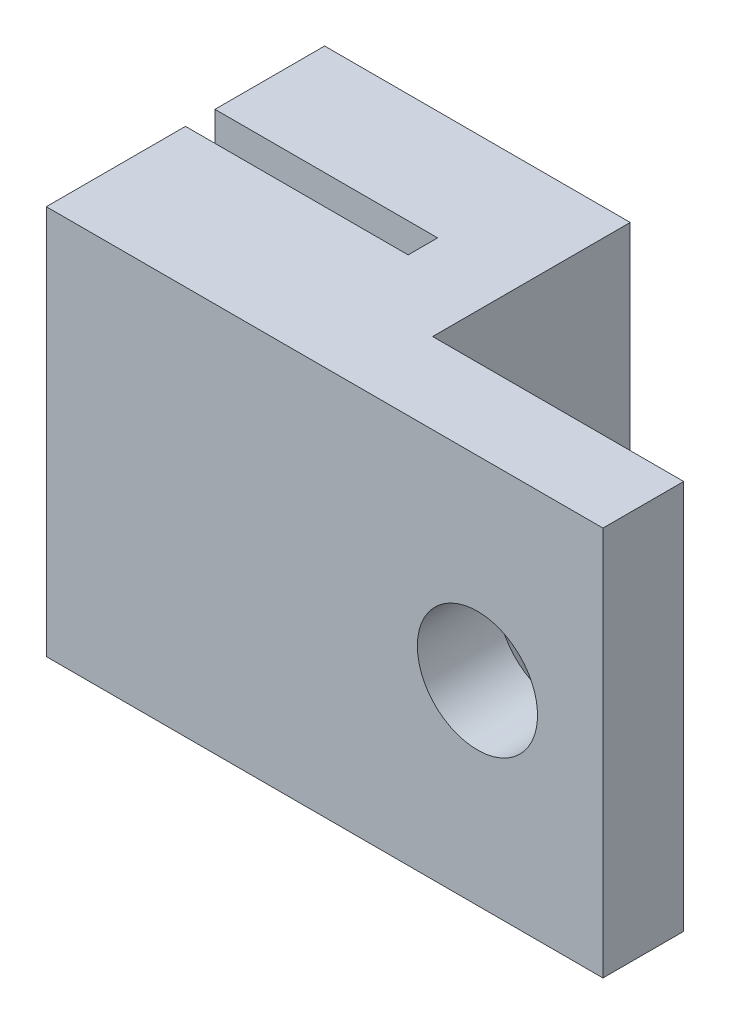
ISO-10303-21;
HEADER;
FILE_DESCRIPTION(('STEP AP214'),'2;1');
FILE_NAME('part.step','',(''),(''),'','','');
FILE_SCHEMA(('AUTOMOTIVE_DESIGN { 1 0 10303 214 1 1 1 1 }'));
ENDSEC;
DATA;
#1=APPLICATION_CONTEXT('core data for automotive mechanical design processes');
#2=APPLICATION_PROTOCOL_DEFINITION('international standard','automotive_design',2000,#1);
#3=PRODUCT_CONTEXT('',#1,'mechanical');
#4=PRODUCT('Part','Part','',(#3));
#5=PRODUCT_RELATED_PRODUCT_CATEGORY('part','',(#4));
#6=PRODUCT_DEFINITION_FORMATION('','',#4);
#7=PRODUCT_DEFINITION_CONTEXT('part definition',#1,'design');
#8=PRODUCT_DEFINITION('design','',#6,#7);
#9=PRODUCT_DEFINITION_SHAPE('','',#8);
#10=(LENGTH_UNIT() NAMED_UNIT(*) SI_UNIT(.MILLI.,.METRE.));
#11=(NAMED_UNIT(*) PLANE_ANGLE_UNIT() SI_UNIT($,.RADIAN.));
#12=(NAMED_UNIT(*) SI_UNIT($,.STERADIAN.) SOLID_ANGLE_UNIT());
#13=UNCERTAINTY_MEASURE_WITH_UNIT(LENGTH_MEASURE(1.E-05),#10,'distance_accuracy_value','');
#14=(GEOMETRIC_REPRESENTATION_CONTEXT(3) GLOBAL_UNCERTAINTY_ASSIGNED_CONTEXT((#13)) GLOBAL_UNIT_ASSIGNED_CONTEXT((#10,
#11,#12)) REPRESENTATION_CONTEXT('',''));
#15=CARTESIAN_POINT('',(0.,0.,0.));
#16=DIRECTION('',(0.,0.,1.));
#17=DIRECTION('',(1.,0.,0.));
#18=AXIS2_PLACEMENT_3D('',#15,#16,#17);
#19=CARTESIAN_POINT('',(0.,-14.,391.676417727354));
#20=DIRECTION('',(0.,0.,1.));
#21=DIRECTION('',(1.,0.,0.));
#22=AXIS2_PLACEMENT_3D('',#19,#20,#21);
#23=PLANE('',#22);
#24=DIRECTION('',(1.,0.,0.));
#25=VECTOR('',#24,1.);
#26=CARTESIAN_POINT('',(0.,0.,391.676417727354));
#27=LINE('',#26,#25);
#28=CARTESIAN_POINT('',(-1237.71012145749,0.,391.676417727354));
#29=VERTEX_POINT('',#28);
#30=CARTESIAN_POINT('',(-1229.71012145749,0.,391.676417727354));
#31=VERTEX_POINT('',#30);
#32=EDGE_CURVE('E144',#29,#31,#27,.T.);
#33=ORIENTED_EDGE('',*,*,#32,.F.);
#34=DIRECTION('',(0.,1.,0.));
#35=VECTOR('',#34,1.);
#36=CARTESIAN_POINT('',(-1237.71012145749,-14.,391.676417727354));
#37=LINE('',#36,#35);
#38=CARTESIAN_POINT('',(-1237.71012145749,-14.,391.676417727354));
#39=VERTEX_POINT('',#38);
#40=EDGE_CURVE('E11',#39,#29,#37,.T.);
#41=ORIENTED_EDGE('',*,*,#40,.F.);
#42=DIRECTION('',(1.,0.,0.));
#43=VECTOR('',#42,1.);
#44=CARTESIAN_POINT('',(0.,-14.,391.676417727354));
#45=LINE('',#44,#43);
#46=CARTESIAN_POINT('',(-1229.71012145749,-14.,391.676417727354));
#47=VERTEX_POINT('',#46);
#48=EDGE_CURVE('E173',#39,#47,#45,.T.);
#49=ORIENTED_EDGE('',*,*,#48,.T.);
#50=DIRECTION('',(0.,1.,0.));
#51=VECTOR('',#50,1.);
#52=CARTESIAN_POINT('',(-1229.71012145749,-14.,391.676417727354));
#53=LINE('',#52,#51);
#54=EDGE_CURVE('E38',#47,#31,#53,.T.);
#55=ORIENTED_EDGE('',*,*,#54,.T.);
#56=EDGE_LOOP('',(#33,#41,#49,#55));
#57=FACE_BOUND('',#56,.T.);
#58=ADVANCED_FACE('F35',(#57),#23,.T.);
#59=CARTESIAN_POINT('',(-1237.71012145749,-14.,0.));
#60=DIRECTION('',(1.,0.,0.));
#61=DIRECTION('',(0.,0.,-1.));
#62=AXIS2_PLACEMENT_3D('',#59,#60,#61);
#63=PLANE('',#62);
#64=DIRECTION('',(0.,0.,-1.));
#65=VECTOR('',#64,1.);
#66=CARTESIAN_POINT('',(-1237.71012145749,0.,0.));
#67=LINE('',#66,#65);
#68=CARTESIAN_POINT('',(-1237.71012145749,0.,387.736417727354));
#69=VERTEX_POINT('',#68);
#70=EDGE_CURVE('E157',#29,#69,#67,.T.);
#71=ORIENTED_EDGE('',*,*,#70,.T.);
#72=DIRECTION('',(0.,1.,0.));
#73=VECTOR('',#72,1.);
#74=CARTESIAN_POINT('',(-1237.71012145749,-14.,387.736417727354));
#75=LINE('',#74,#73);
#76=CARTESIAN_POINT('',(-1237.71012145749,-14.,387.736417727354));
#77=VERTEX_POINT('',#76);
#78=EDGE_CURVE('E43',#77,#69,#75,.T.);
#79=ORIENTED_EDGE('',*,*,#78,.F.);
#80=DIRECTION('',(0.,0.,-1.));
#81=VECTOR('',#80,1.);
#82=CARTESIAN_POINT('',(-1237.71012145749,-14.,0.));
#83=LINE('',#82,#81);
#84=EDGE_CURVE('E140',#39,#77,#83,.T.);
#85=ORIENTED_EDGE('',*,*,#84,.F.);
#86=ORIENTED_EDGE('',*,*,#40,.T.);
#87=EDGE_LOOP('',(#71,#79,#85,#86));
#88=FACE_BOUND('',#87,.T.);
#89=ADVANCED_FACE('F174',(#88),#63,.F.);
#90=CARTESIAN_POINT('',(0.,-14.,387.736417727354));
#91=DIRECTION('',(0.,0.,1.));
#92=DIRECTION('',(1.,0.,0.));
#93=AXIS2_PLACEMENT_3D('',#90,#91,#92);
#94=PLANE('',#93);
#95=DIRECTION('',(1.,0.,0.));
#96=VECTOR('',#95,1.);
#97=CARTESIAN_POINT('',(0.,0.,387.736417727354));
#98=LINE('',#97,#96);
#99=CARTESIAN_POINT('',(-1226.72982017208,0.,387.736417727354));
#100=VERTEX_POINT('',#99);
#101=EDGE_CURVE('E160',#69,#100,#98,.T.);
#102=ORIENTED_EDGE('',*,*,#101,.T.);
#103=DIRECTION('',(0.,1.,0.));
#104=VECTOR('',#103,1.);
#105=CARTESIAN_POINT('',(-1226.72982017208,-14.,387.736417727354));
#106=LINE('',#105,#104);
#107=CARTESIAN_POINT('',(-1226.72982017208,-14.,387.736417727354));
#108=VERTEX_POINT('',#107);
#109=EDGE_CURVE('E148',#108,#100,#106,.T.);
#110=ORIENTED_EDGE('',*,*,#109,.F.);
#111=DIRECTION('',(1.,0.,0.));
#112=VECTOR('',#111,1.);
#113=CARTESIAN_POINT('',(0.,-14.,387.736417727354));
#114=LINE('',#113,#112);
#115=EDGE_CURVE('E132',#77,#108,#114,.T.);
#116=ORIENTED_EDGE('',*,*,#115,.F.);
#117=ORIENTED_EDGE('',*,*,#78,.T.);
#118=EDGE_LOOP('',(#102,#110,#116,#117));
#119=FACE_BOUND('',#118,.T.);
#120=ADVANCED_FACE('F178',(#119),#94,.F.);
#121=CARTESIAN_POINT('',(-1217.71012145749,-14.,0.));
#122=DIRECTION('',(1.,0.,0.));
#123=DIRECTION('',(0.,0.,-1.));
#124=AXIS2_PLACEMENT_3D('',#121,#122,#123);
#125=PLANE('',#124);
#126=DIRECTION('',(0.,1.,0.));
#127=VECTOR('',#126,1.);
#128=CARTESIAN_POINT('',(-1217.71012145749,-14.,394.836001477778));
#129=LINE('',#128,#127);
#130=CARTESIAN_POINT('',(-1217.71012145749,-14.,394.836001477778));
#131=VERTEX_POINT('',#130);
#132=CARTESIAN_POINT('',(-1217.71012145749,0.,394.836001477778));
#133=VERTEX_POINT('',#132);
#134=EDGE_CURVE('E181',#131,#133,#129,.T.);
#135=ORIENTED_EDGE('',*,*,#134,.T.);
#136=DIRECTION('',(0.,0.,-1.));
#137=VECTOR('',#136,1.);
#138=CARTESIAN_POINT('',(-1217.71012145749,0.,0.));
#139=LINE('',#138,#137);
#140=CARTESIAN_POINT('',(-1217.71012145749,0.,397.736417727354));
#141=VERTEX_POINT('',#140);
#142=EDGE_CURVE('E116',#141,#133,#139,.T.);
#143=ORIENTED_EDGE('',*,*,#142,.F.);
#144=DIRECTION('',(0.,1.,0.));
#145=VECTOR('',#144,1.);
#146=CARTESIAN_POINT('',(-1217.71012145749,-14.,397.736417727354));
#147=LINE('',#146,#145);
#148=CARTESIAN_POINT('',(-1217.71012145749,-14.,397.736417727354));
#149=VERTEX_POINT('',#148);
#150=EDGE_CURVE('E109',#149,#141,#147,.T.);
#151=ORIENTED_EDGE('',*,*,#150,.F.);
#152=DIRECTION('',(0.,0.,-1.));
#153=VECTOR('',#152,1.);
#154=CARTESIAN_POINT('',(-1217.71012145749,-14.,0.));
#155=LINE('',#154,#153);
#156=EDGE_CURVE('E114',#149,#131,#155,.T.);
#157=ORIENTED_EDGE('',*,*,#156,.T.);
#158=EDGE_LOOP('',(#135,#143,#151,#157));
#159=FACE_BOUND('',#158,.T.);
#160=ADVANCED_FACE('F112',(#159),#125,.T.);
#161=CARTESIAN_POINT('',(0.,-14.,397.736417727354));
#162=DIRECTION('',(0.,0.,1.));
#163=DIRECTION('',(1.,0.,0.));
#164=AXIS2_PLACEMENT_3D('',#161,#162,#163);
#165=PLANE('',#164);
#166=CARTESIAN_POINT('',(-1222.21997081479,-7.,397.736417727354));
#167=DIRECTION('',(0.,0.,-1.));
#168=DIRECTION('',(-1.,0.,0.));
#169=AXIS2_PLACEMENT_3D('',#166,#167,#168);
#170=CIRCLE('',#169,2.15899999999997);
#171=CARTESIAN_POINT('',(-1224.37897081479,-7.,397.736417727354));
#172=VERTEX_POINT('',#171);
#173=EDGE_CURVE('E217',#172,#172,#170,.T.);
#174=ORIENTED_EDGE('',*,*,#173,.T.);
#175=EDGE_LOOP('',(#174));
#176=FACE_BOUND('',#175,.T.);
#177=DIRECTION('',(1.,0.,0.));
#178=VECTOR('',#177,1.);
#179=CARTESIAN_POINT('',(0.,0.,397.736417727354));
#180=LINE('',#179,#178);
#181=CARTESIAN_POINT('',(-1237.71012145749,0.,397.736417727354));
#182=VERTEX_POINT('',#181);
#183=EDGE_CURVE('E156',#182,#141,#180,.T.);
#184=ORIENTED_EDGE('',*,*,#183,.F.);
#185=DIRECTION('',(0.,1.,0.));
#186=VECTOR('',#185,1.);
#187=CARTESIAN_POINT('',(-1237.71012145749,-14.,397.736417727354));
#188=LINE('',#187,#186);
#189=CARTESIAN_POINT('',(-1237.71012145749,-14.,397.736417727354));
#190=VERTEX_POINT('',#189);
#191=EDGE_CURVE('E121',#190,#182,#188,.T.);
#192=ORIENTED_EDGE('',*,*,#191,.F.);
#193=DIRECTION('',(1.,0.,0.));
#194=VECTOR('',#193,1.);
#195=CARTESIAN_POINT('',(0.,-14.,397.736417727354));
#196=LINE('',#195,#194);
#197=EDGE_CURVE('E128',#190,#149,#196,.T.);
#198=ORIENTED_EDGE('',*,*,#197,.T.);
#199=ORIENTED_EDGE('',*,*,#150,.T.);
#200=EDGE_LOOP('',(#184,#192,#198,#199));
#201=FACE_BOUND('',#200,.T.);
#202=ADVANCED_FACE('F134',(#176,#201),#165,.T.);
#203=CARTESIAN_POINT('',(-1237.71012145749,0.,392.736417727354));
#204=VERTEX_POINT('',#203);
#205=EDGE_CURVE('E154',#182,#204,#67,.T.);
#206=ORIENTED_EDGE('',*,*,#205,.T.);
#207=DIRECTION('',(0.,1.,0.));
#208=VECTOR('',#207,1.);
#209=CARTESIAN_POINT('',(-1237.71012145749,-14.,392.736417727354));
#210=LINE('',#209,#208);
#211=CARTESIAN_POINT('',(-1237.71012145749,-14.,392.736417727354));
#212=VERTEX_POINT('',#211);
#213=EDGE_CURVE('E166',#212,#204,#210,.T.);
#214=ORIENTED_EDGE('',*,*,#213,.F.);
#215=EDGE_CURVE('E136',#190,#212,#83,.T.);
#216=ORIENTED_EDGE('',*,*,#215,.F.);
#217=ORIENTED_EDGE('',*,*,#191,.T.);
#218=EDGE_LOOP('',(#206,#214,#216,#217));
#219=FACE_BOUND('',#218,.T.);
#220=ADVANCED_FACE('F205',(#219),#63,.F.);
#221=CARTESIAN_POINT('',(0.,-14.,392.736417727354));
#222=DIRECTION('',(0.,0.,1.));
#223=DIRECTION('',(1.,0.,0.));
#224=AXIS2_PLACEMENT_3D('',#221,#222,#223);
#225=PLANE('',#224);
#226=DIRECTION('',(1.,0.,0.));
#227=VECTOR('',#226,1.);
#228=CARTESIAN_POINT('',(0.,0.,392.736417727354));
#229=LINE('',#228,#227);
#230=CARTESIAN_POINT('',(-1229.71012145749,0.,392.736417727354));
#231=VERTEX_POINT('',#230);
#232=EDGE_CURVE('E151',#204,#231,#229,.T.);
#233=ORIENTED_EDGE('',*,*,#232,.T.);
#234=DIRECTION('',(0.,1.,0.));
#235=VECTOR('',#234,1.);
#236=CARTESIAN_POINT('',(-1229.71012145749,-14.,392.736417727354));
#237=LINE('',#236,#235);
#238=CARTESIAN_POINT('',(-1229.71012145749,-14.,392.736417727354));
#239=VERTEX_POINT('',#238);
#240=EDGE_CURVE('E168',#239,#231,#237,.T.);
#241=ORIENTED_EDGE('',*,*,#240,.F.);
#242=DIRECTION('',(1.,0.,0.));
#243=VECTOR('',#242,1.);
#244=CARTESIAN_POINT('',(0.,-14.,392.736417727354));
#245=LINE('',#244,#243);
#246=EDGE_CURVE('E138',#212,#239,#245,.T.);
#247=ORIENTED_EDGE('',*,*,#246,.F.);
#248=ORIENTED_EDGE('',*,*,#213,.T.);
#249=EDGE_LOOP('',(#233,#241,#247,#248));
#250=FACE_BOUND('',#249,.T.);
#251=ADVANCED_FACE('F195',(#250),#225,.F.);
#252=CARTESIAN_POINT('',(-1229.71012145749,-14.,0.));
#253=DIRECTION('',(-1.,0.,0.));
#254=DIRECTION('',(0.,0.,1.));
#255=AXIS2_PLACEMENT_3D('',#252,#253,#254);
#256=PLANE('',#255);
#257=DIRECTION('',(0.,0.,1.));
#258=VECTOR('',#257,1.);
#259=CARTESIAN_POINT('',(-1229.71012145749,0.,0.));
#260=LINE('',#259,#258);
#261=EDGE_CURVE('E147',#31,#231,#260,.T.);
#262=ORIENTED_EDGE('',*,*,#261,.F.);
#263=ORIENTED_EDGE('',*,*,#54,.F.);
#264=DIRECTION('',(0.,0.,1.));
#265=VECTOR('',#264,1.);
#266=CARTESIAN_POINT('',(-1229.71012145749,-14.,0.));
#267=LINE('',#266,#265);
#268=EDGE_CURVE('E191',#47,#239,#267,.T.);
#269=ORIENTED_EDGE('',*,*,#268,.T.);
#270=ORIENTED_EDGE('',*,*,#240,.T.);
#271=EDGE_LOOP('',(#262,#263,#269,#270));
#272=FACE_BOUND('',#271,.T.);
#273=ADVANCED_FACE('F197',(#272),#256,.T.);
#274=CARTESIAN_POINT('',(0.,-14.,0.));
#275=DIRECTION('',(0.,1.,0.));
#276=DIRECTION('',(0.,0.,1.));
#277=AXIS2_PLACEMENT_3D('',#274,#275,#276);
#278=PLANE('',#277);
#279=ORIENTED_EDGE('',*,*,#115,.T.);
#280=DIRECTION('',(0.,0.,1.));
#281=VECTOR('',#280,1.);
#282=CARTESIAN_POINT('',(-1226.72982017208,-14.,387.736417727354));
#283=LINE('',#282,#281);
#284=CARTESIAN_POINT('',(-1226.72982017208,-14.,394.836001477778));
#285=VERTEX_POINT('',#284);
#286=EDGE_CURVE('E218',#108,#285,#283,.T.);
#287=ORIENTED_EDGE('',*,*,#286,.T.);
#288=DIRECTION('',(1.,0.,0.));
#289=VECTOR('',#288,1.);
#290=CARTESIAN_POINT('',(-1226.72982017208,-14.,394.836001477778));
#291=LINE('',#290,#289);
#292=EDGE_CURVE('E131',#285,#131,#291,.T.);
#293=ORIENTED_EDGE('',*,*,#292,.T.);
#294=ORIENTED_EDGE('',*,*,#156,.F.);
#295=ORIENTED_EDGE('',*,*,#197,.F.);
#296=ORIENTED_EDGE('',*,*,#215,.T.);
#297=ORIENTED_EDGE('',*,*,#246,.T.);
#298=ORIENTED_EDGE('',*,*,#268,.F.);
#299=ORIENTED_EDGE('',*,*,#48,.F.);
#300=ORIENTED_EDGE('',*,*,#84,.T.);
#301=EDGE_LOOP('',(#279,#287,#293,#294,#295,#296,#297,#298,#299,#300));
#302=FACE_BOUND('',#301,.T.);
#303=ADVANCED_FACE('F127',(#302),#278,.F.);
#304=CARTESIAN_POINT('',(0.,0.,0.));
#305=DIRECTION('',(0.,1.,0.));
#306=DIRECTION('',(0.,0.,1.));
#307=AXIS2_PLACEMENT_3D('',#304,#305,#306);
#308=PLANE('',#307);
#309=DIRECTION('',(0.,0.,1.));
#310=VECTOR('',#309,1.);
#311=CARTESIAN_POINT('',(-1226.72982017208,0.,387.736417727354));
#312=LINE('',#311,#310);
#313=CARTESIAN_POINT('',(-1226.72982017208,0.,394.836001477778));
#314=VERTEX_POINT('',#313);
#315=EDGE_CURVE('E51',#100,#314,#312,.T.);
#316=ORIENTED_EDGE('',*,*,#315,.F.);
#317=ORIENTED_EDGE('',*,*,#101,.F.);
#318=ORIENTED_EDGE('',*,*,#70,.F.);
#319=ORIENTED_EDGE('',*,*,#32,.T.);
#320=ORIENTED_EDGE('',*,*,#261,.T.);
#321=ORIENTED_EDGE('',*,*,#232,.F.);
#322=ORIENTED_EDGE('',*,*,#205,.F.);
#323=ORIENTED_EDGE('',*,*,#183,.T.);
#324=ORIENTED_EDGE('',*,*,#142,.T.);
#325=DIRECTION('',(1.,0.,0.));
#326=VECTOR('',#325,1.);
#327=CARTESIAN_POINT('',(-1226.72982017208,0.,394.836001477778));
#328=LINE('',#327,#326);
#329=EDGE_CURVE('E186',#314,#133,#328,.T.);
#330=ORIENTED_EDGE('',*,*,#329,.F.);
#331=EDGE_LOOP('',(#316,#317,#318,#319,#320,#321,#322,#323,#324,#330));
#332=FACE_BOUND('',#331,.T.);
#333=ADVANCED_FACE('F203',(#332),#308,.T.);
#334=CARTESIAN_POINT('',(-1226.72982017208,-14.,387.736417727354));
#335=DIRECTION('',(-1.,0.,0.));
#336=DIRECTION('',(0.,0.,1.));
#337=AXIS2_PLACEMENT_3D('',#334,#335,#336);
#338=PLANE('',#337);
#339=ORIENTED_EDGE('',*,*,#315,.T.);
#340=DIRECTION('',(0.,1.,0.));
#341=VECTOR('',#340,1.);
#342=CARTESIAN_POINT('',(-1226.72982017208,-14.,394.836001477778));
#343=LINE('',#342,#341);
#344=EDGE_CURVE('E183',#285,#314,#343,.T.);
#345=ORIENTED_EDGE('',*,*,#344,.F.);
#346=ORIENTED_EDGE('',*,*,#286,.F.);
#347=ORIENTED_EDGE('',*,*,#109,.T.);
#348=EDGE_LOOP('',(#339,#345,#346,#347));
#349=FACE_BOUND('',#348,.T.);
#350=ADVANCED_FACE('F233',(#349),#338,.F.);
#351=CARTESIAN_POINT('',(-1226.72982017208,-14.,394.836001477778));
#352=DIRECTION('',(0.,0.,1.));
#353=DIRECTION('',(1.,0.,0.));
#354=AXIS2_PLACEMENT_3D('',#351,#352,#353);
#355=PLANE('',#354);
#356=CARTESIAN_POINT('',(-1222.21997081479,-7.,394.836001477778));
#357=DIRECTION('',(0.,0.,-1.));
#358=DIRECTION('',(-1.,0.,0.));
#359=AXIS2_PLACEMENT_3D('',#356,#357,#358);
#360=CIRCLE('',#359,2.15899999999997);
#361=CARTESIAN_POINT('',(-1224.37897081479,-7.,394.836001477778));
#362=VERTEX_POINT('',#361);
#363=EDGE_CURVE('E220',#362,#362,#360,.T.);
#364=ORIENTED_EDGE('',*,*,#363,.F.);
#365=EDGE_LOOP('',(#364));
#366=FACE_BOUND('',#365,.T.);
#367=ORIENTED_EDGE('',*,*,#329,.T.);
#368=ORIENTED_EDGE('',*,*,#134,.F.);
#369=ORIENTED_EDGE('',*,*,#292,.F.);
#370=ORIENTED_EDGE('',*,*,#344,.T.);
#371=EDGE_LOOP('',(#367,#368,#369,#370));
#372=FACE_BOUND('',#371,.T.);
#373=ADVANCED_FACE('F230',(#366,#372),#355,.F.);
#374=CARTESIAN_POINT('',(-1222.21997081479,-7.,397.736417727354));
#375=DIRECTION('',(0.,0.,-1.));
#376=DIRECTION('',(-1.,0.,0.));
#377=AXIS2_PLACEMENT_3D('',#374,#375,#376);
#378=CYLINDRICAL_SURFACE('',#377,2.15899999999997);
#379=CARTESIAN_POINT('',(-1224.37897081479,-7.,397.736417727354));
#380=CARTESIAN_POINT('',(-1224.37897081479,-7.,397.706205058087));
#381=CARTESIAN_POINT('',(-1224.37897081479,-7.,397.675992388821));
#382=CARTESIAN_POINT('',(-1224.37897081479,-7.,397.615567050288));
#383=CARTESIAN_POINT('',(-1224.37897081479,-7.,397.585354381021));
#384=CARTESIAN_POINT('',(-1224.37897081479,-7.,397.524929042489));
#385=CARTESIAN_POINT('',(-1224.37897081479,-7.,397.494716373222));
#386=CARTESIAN_POINT('',(-1224.37897081479,-7.,397.434291034689));
#387=CARTESIAN_POINT('',(-1224.37897081479,-7.,397.404078365423));
#388=CARTESIAN_POINT('',(-1224.37897081479,-7.,397.34365302689));
#389=CARTESIAN_POINT('',(-1224.37897081479,-7.,397.313440357624));
#390=CARTESIAN_POINT('',(-1224.37897081479,-7.,397.253015019091));
#391=CARTESIAN_POINT('',(-1224.37897081479,-7.,397.222802349824));
#392=CARTESIAN_POINT('',(-1224.37897081479,-7.,397.162377011292));
#393=CARTESIAN_POINT('',(-1224.37897081479,-7.,397.132164342025));
#394=CARTESIAN_POINT('',(-1224.37897081479,-7.,397.071739003492));
#395=CARTESIAN_POINT('',(-1224.37897081479,-7.,397.041526334226));
#396=CARTESIAN_POINT('',(-1224.37897081479,-7.,396.981100995693));
#397=CARTESIAN_POINT('',(-1224.37897081479,-7.,396.950888326427));
#398=CARTESIAN_POINT('',(-1224.37897081479,-7.,396.890462987894));
#399=CARTESIAN_POINT('',(-1224.37897081479,-7.,396.860250318627));
#400=CARTESIAN_POINT('',(-1224.37897081479,-7.,396.799824980095));
#401=CARTESIAN_POINT('',(-1224.37897081479,-7.,396.769612310828));
#402=CARTESIAN_POINT('',(-1224.37897081479,-7.,396.709186972295));
#403=CARTESIAN_POINT('',(-1224.37897081479,-7.,396.678974303029));
#404=CARTESIAN_POINT('',(-1224.37897081479,-7.,396.618548964496));
#405=CARTESIAN_POINT('',(-1224.37897081479,-7.,396.58833629523));
#406=CARTESIAN_POINT('',(-1224.37897081479,-7.,396.527910956697));
#407=CARTESIAN_POINT('',(-1224.37897081479,-7.,396.49769828743));
#408=CARTESIAN_POINT('',(-1224.37897081479,-7.,396.437272948898));
#409=CARTESIAN_POINT('',(-1224.37897081479,-7.,396.407060279631));
#410=CARTESIAN_POINT('',(-1224.37897081479,-7.,396.346634941098));
#411=CARTESIAN_POINT('',(-1224.37897081479,-7.,396.316422271832));
#412=CARTESIAN_POINT('',(-1224.37897081479,-7.,396.255996933299));
#413=CARTESIAN_POINT('',(-1224.37897081479,-7.,396.225784264033));
#414=CARTESIAN_POINT('',(-1224.37897081479,-7.,396.1653589255));
#415=CARTESIAN_POINT('',(-1224.37897081479,-7.,396.135146256233));
#416=CARTESIAN_POINT('',(-1224.37897081479,-7.,396.074720917701));
#417=CARTESIAN_POINT('',(-1224.37897081479,-7.,396.044508248434));
#418=CARTESIAN_POINT('',(-1224.37897081479,-7.,395.984082909901));
#419=CARTESIAN_POINT('',(-1224.37897081479,-7.,395.953870240635));
#420=CARTESIAN_POINT('',(-1224.37897081479,-7.,395.893444902102));
#421=CARTESIAN_POINT('',(-1224.37897081479,-7.,395.863232232836));
#422=CARTESIAN_POINT('',(-1224.37897081479,-7.,395.802806894303));
#423=CARTESIAN_POINT('',(-1224.37897081479,-7.,395.772594225037));
#424=CARTESIAN_POINT('',(-1224.37897081479,-7.,395.712168886504));
#425=CARTESIAN_POINT('',(-1224.37897081479,-7.,395.681956217237));
#426=CARTESIAN_POINT('',(-1224.37897081479,-7.,395.621530878704));
#427=CARTESIAN_POINT('',(-1224.37897081479,-7.,395.591318209438));
#428=CARTESIAN_POINT('',(-1224.37897081479,-7.,395.530892870905));
#429=CARTESIAN_POINT('',(-1224.37897081479,-7.,395.500680201639));
#430=CARTESIAN_POINT('',(-1224.37897081479,-7.,395.440254863106));
#431=CARTESIAN_POINT('',(-1224.37897081479,-7.,395.41004219384));
#432=CARTESIAN_POINT('',(-1224.37897081479,-7.,395.349616855307));
#433=CARTESIAN_POINT('',(-1224.37897081479,-7.,395.31940418604));
#434=CARTESIAN_POINT('',(-1224.37897081479,-7.,395.258978847507));
#435=CARTESIAN_POINT('',(-1224.37897081479,-7.,395.228766178241));
#436=CARTESIAN_POINT('',(-1224.37897081479,-7.,395.168340839708));
#437=CARTESIAN_POINT('',(-1224.37897081479,-7.,395.138128170442));
#438=CARTESIAN_POINT('',(-1224.37897081479,-7.,395.077702831909));
#439=CARTESIAN_POINT('',(-1224.37897081479,-7.,395.047490162643));
#440=CARTESIAN_POINT('',(-1224.37897081479,-7.,394.98706482411));
#441=CARTESIAN_POINT('',(-1224.37897081479,-7.,394.956852154843));
#442=CARTESIAN_POINT('',(-1224.37897081479,-7.,394.89642681631));
#443=CARTESIAN_POINT('',(-1224.37897081479,-7.,394.866214147044));
#444=CARTESIAN_POINT('',(-1224.37897081479,-7.,394.836001477778));
#445=B_SPLINE_CURVE_WITH_KNOTS('',3,(#379,#380,#381,#382,#383,#384,#385,#386,#387,#388,#389,
#390,#391,#392,#393,#394,#395,#396,#397,#398,#399,#400,#401,#402,#403,#404,#405,#406,#407,#408,
#409,#410,#411,#412,#413,#414,#415,#416,#417,#418,#419,#420,#421,#422,#423,#424,#425,#426,#427,
#428,#429,#430,#431,#432,#433,#434,#435,#436,#437,#438,#439,#440,#441,#442,#443,#444),
.UNSPECIFIED.,.F.,.F.,(4,2,2,2,2,2,2,2,2,2,2,2,2,2,2,2,2,2,2,2,2,2,2,2,2,2,2,2,2,2,2,2,4),(0.,
0.0906380077992375,0.181276015598475,0.271914023397712,0.36255203119695,0.453190038996187,
0.54382804679548,0.634466054594718,0.725104062393955,0.815742070193193,0.90638007799243,
0.997018085791723,1.08765609359096,1.1782941013902,1.26893210918944,1.35957011698867,
1.45020812478797,1.5408461325872,1.63148414038644,1.72212214818568,1.81276015598492,
1.90339816378415,1.99403617158345,2.08467417938268,2.17531218718192,2.26595019498116,
2.3565882027804,2.44722621057969,2.53786421837893,2.62850222617816,2.7191402339774,
2.80977824177664,2.90041624957593),.UNSPECIFIED.);
#446=EDGE_CURVE('BSEAM228',#172,#362,#445,.T.);
#447=ORIENTED_EDGE('',*,*,#173,.F.);
#448=ORIENTED_EDGE('',*,*,#363,.T.);
#449=ORIENTED_EDGE('',*,*,#446,.T.);
#450=ORIENTED_EDGE('',*,*,#446,.F.);
#451=EDGE_LOOP('',(#447,#449,#448,#450));
#452=FACE_BOUND('',#451,.T.);
#453=ADVANCED_FACE('F228',(#452),#378,.F.);
#454=CLOSED_SHELL('',(#58,#89,#120,#160,#202,#220,#251,#273,#303,#333,#350,#373,#453));
#455=MANIFOLD_SOLID_BREP('B2',#454);
#456=ADVANCED_BREP_SHAPE_REPRESENTATION('',(#18,#455),#14);
#457=SHAPE_DEFINITION_REPRESENTATION(#9,#456);
ENDSEC;
END-ISO-10303-21;
